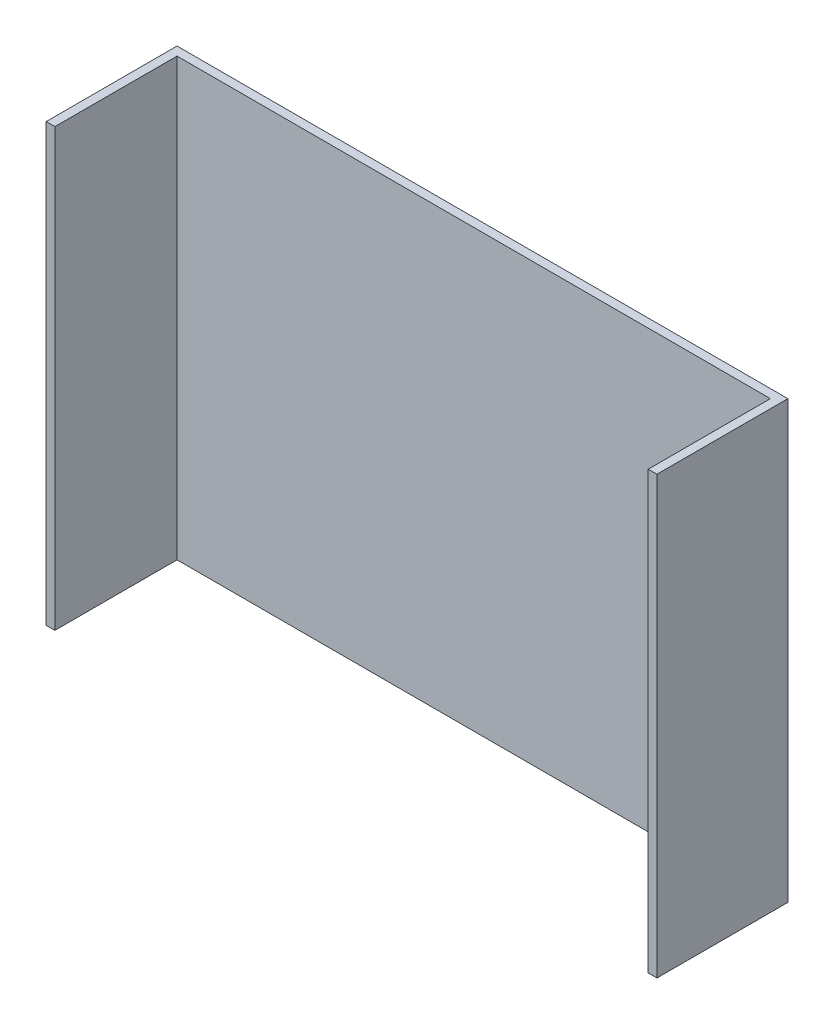
ISO-10303-21;
HEADER;
FILE_DESCRIPTION(('STEP AP214'),'2;1');
FILE_NAME('part.step','',(''),(''),'','','');
FILE_SCHEMA(('AUTOMOTIVE_DESIGN { 1 0 10303 214 1 1 1 1 }'));
ENDSEC;
DATA;
#1=APPLICATION_CONTEXT('core data for automotive mechanical design processes');
#2=APPLICATION_PROTOCOL_DEFINITION('international standard','automotive_design',2000,#1);
#3=PRODUCT_CONTEXT('',#1,'mechanical');
#4=PRODUCT('Part','Part','',(#3));
#5=PRODUCT_RELATED_PRODUCT_CATEGORY('part','',(#4));
#6=PRODUCT_DEFINITION_FORMATION('','',#4);
#7=PRODUCT_DEFINITION_CONTEXT('part definition',#1,'design');
#8=PRODUCT_DEFINITION('design','',#6,#7);
#9=PRODUCT_DEFINITION_SHAPE('','',#8);
#10=(LENGTH_UNIT() NAMED_UNIT(*) SI_UNIT(.MILLI.,.METRE.));
#11=(NAMED_UNIT(*) PLANE_ANGLE_UNIT() SI_UNIT($,.RADIAN.));
#12=(NAMED_UNIT(*) SI_UNIT($,.STERADIAN.) SOLID_ANGLE_UNIT());
#13=UNCERTAINTY_MEASURE_WITH_UNIT(LENGTH_MEASURE(1.E-05),#10,'distance_accuracy_value','');
#14=(GEOMETRIC_REPRESENTATION_CONTEXT(3) GLOBAL_UNCERTAINTY_ASSIGNED_CONTEXT((#13)) GLOBAL_UNIT_ASSIGNED_CONTEXT((#10,
#11,#12)) REPRESENTATION_CONTEXT('',''));
#15=CARTESIAN_POINT('',(0.,0.,0.));
#16=DIRECTION('',(0.,0.,1.));
#17=DIRECTION('',(1.,0.,0.));
#18=AXIS2_PLACEMENT_3D('',#15,#16,#17);
#19=CARTESIAN_POINT('',(0.,0.,30.));
#20=DIRECTION('',(0.,0.,1.));
#21=DIRECTION('',(1.,0.,0.));
#22=AXIS2_PLACEMENT_3D('',#19,#20,#21);
#23=PLANE('',#22);
#24=DIRECTION('',(0.,-1.,0.));
#25=VECTOR('',#24,1.);
#26=CARTESIAN_POINT('',(-138.,0.,30.));
#27=LINE('',#26,#25);
#28=CARTESIAN_POINT('',(-138.,100.,30.));
#29=VERTEX_POINT('',#28);
#30=CARTESIAN_POINT('',(-138.,0.,30.));
#31=VERTEX_POINT('',#30);
#32=EDGE_CURVE('E113',#29,#31,#27,.T.);
#33=ORIENTED_EDGE('',*,*,#32,.F.);
#34=DIRECTION('',(-1.,0.,0.));
#35=VECTOR('',#34,1.);
#36=CARTESIAN_POINT('',(0.,100.,30.));
#37=LINE('',#36,#35);
#38=CARTESIAN_POINT('',(-140.,100.,30.));
#39=VERTEX_POINT('',#38);
#40=EDGE_CURVE('E144',#29,#39,#37,.T.);
#41=ORIENTED_EDGE('',*,*,#40,.T.);
#42=DIRECTION('',(0.,-1.,0.));
#43=VECTOR('',#42,1.);
#44=CARTESIAN_POINT('',(-140.,0.,30.));
#45=LINE('',#44,#43);
#46=CARTESIAN_POINT('',(-140.,0.,30.));
#47=VERTEX_POINT('',#46);
#48=EDGE_CURVE('E146',#39,#47,#45,.T.);
#49=ORIENTED_EDGE('',*,*,#48,.T.);
#50=DIRECTION('',(1.,0.,0.));
#51=VECTOR('',#50,1.);
#52=CARTESIAN_POINT('',(0.,0.,30.));
#53=LINE('',#52,#51);
#54=EDGE_CURVE('E148',#47,#31,#53,.T.);
#55=ORIENTED_EDGE('',*,*,#54,.T.);
#56=EDGE_LOOP('',(#33,#41,#49,#55));
#57=FACE_BOUND('',#56,.T.);
#58=ADVANCED_FACE('F33',(#57),#23,.T.);
#59=CARTESIAN_POINT('',(0.,0.,30.));
#60=DIRECTION('',(-1.,0.,0.));
#61=DIRECTION('',(0.,0.,1.));
#62=AXIS2_PLACEMENT_3D('',#59,#60,#61);
#63=PLANE('',#62);
#64=DIRECTION('',(0.,1.,0.));
#65=VECTOR('',#64,1.);
#66=CARTESIAN_POINT('',(0.,0.,0.));
#67=LINE('',#66,#65);
#68=CARTESIAN_POINT('',(0.,0.,0.));
#69=VERTEX_POINT('',#68);
#70=CARTESIAN_POINT('',(0.,100.,0.));
#71=VERTEX_POINT('',#70);
#72=EDGE_CURVE('E138',#69,#71,#67,.T.);
#73=ORIENTED_EDGE('',*,*,#72,.T.);
#74=DIRECTION('',(0.,0.,-1.));
#75=VECTOR('',#74,1.);
#76=CARTESIAN_POINT('',(0.,100.,30.));
#77=LINE('',#76,#75);
#78=CARTESIAN_POINT('',(0.,100.,30.));
#79=VERTEX_POINT('',#78);
#80=EDGE_CURVE('E11',#79,#71,#77,.T.);
#81=ORIENTED_EDGE('',*,*,#80,.F.);
#82=DIRECTION('',(0.,1.,0.));
#83=VECTOR('',#82,1.);
#84=CARTESIAN_POINT('',(0.,0.,30.));
#85=LINE('',#84,#83);
#86=CARTESIAN_POINT('',(0.,0.,30.));
#87=VERTEX_POINT('',#86);
#88=EDGE_CURVE('E142',#87,#79,#85,.T.);
#89=ORIENTED_EDGE('',*,*,#88,.F.);
#90=DIRECTION('',(0.,0.,-1.));
#91=VECTOR('',#90,1.);
#92=CARTESIAN_POINT('',(0.,0.,30.));
#93=LINE('',#92,#91);
#94=EDGE_CURVE('E150',#87,#69,#93,.T.);
#95=ORIENTED_EDGE('',*,*,#94,.T.);
#96=EDGE_LOOP('',(#73,#81,#89,#95));
#97=FACE_BOUND('',#96,.T.);
#98=ADVANCED_FACE('F35',(#97),#63,.F.);
#99=CARTESIAN_POINT('',(0.,100.,30.));
#100=DIRECTION('',(0.,-1.,0.));
#101=DIRECTION('',(1.,0.,0.));
#102=AXIS2_PLACEMENT_3D('',#99,#100,#101);
#103=PLANE('',#102);
#104=ORIENTED_EDGE('',*,*,#40,.F.);
#105=DIRECTION('',(0.,0.,1.));
#106=VECTOR('',#105,1.);
#107=CARTESIAN_POINT('',(-138.,100.,2.));
#108=LINE('',#107,#106);
#109=CARTESIAN_POINT('',(-138.,100.,2.));
#110=VERTEX_POINT('',#109);
#111=EDGE_CURVE('E136',#110,#29,#108,.T.);
#112=ORIENTED_EDGE('',*,*,#111,.F.);
#113=DIRECTION('',(-1.,0.,0.));
#114=VECTOR('',#113,1.);
#115=CARTESIAN_POINT('',(-138.,100.,2.));
#116=LINE('',#115,#114);
#117=CARTESIAN_POINT('',(-2.,100.,2.));
#118=VERTEX_POINT('',#117);
#119=EDGE_CURVE('E117',#118,#110,#116,.T.);
#120=ORIENTED_EDGE('',*,*,#119,.F.);
#121=DIRECTION('',(0.,0.,1.));
#122=VECTOR('',#121,1.);
#123=CARTESIAN_POINT('',(-2.,100.,2.));
#124=LINE('',#123,#122);
#125=CARTESIAN_POINT('',(-2.,100.,30.));
#126=VERTEX_POINT('',#125);
#127=EDGE_CURVE('E139',#118,#126,#124,.T.);
#128=ORIENTED_EDGE('',*,*,#127,.T.);
#129=EDGE_CURVE('E85',#79,#126,#37,.T.);
#130=ORIENTED_EDGE('',*,*,#129,.F.);
#131=ORIENTED_EDGE('',*,*,#80,.T.);
#132=DIRECTION('',(-1.,0.,0.));
#133=VECTOR('',#132,1.);
#134=CARTESIAN_POINT('',(0.,100.,0.));
#135=LINE('',#134,#133);
#136=CARTESIAN_POINT('',(-140.,100.,0.));
#137=VERTEX_POINT('',#136);
#138=EDGE_CURVE('E153',#71,#137,#135,.T.);
#139=ORIENTED_EDGE('',*,*,#138,.T.);
#140=DIRECTION('',(0.,0.,-1.));
#141=VECTOR('',#140,1.);
#142=CARTESIAN_POINT('',(-140.,100.,30.));
#143=LINE('',#142,#141);
#144=EDGE_CURVE('E41',#39,#137,#143,.T.);
#145=ORIENTED_EDGE('',*,*,#144,.F.);
#146=EDGE_LOOP('',(#104,#112,#120,#128,#130,#131,#139,#145));
#147=FACE_BOUND('',#146,.T.);
#148=ADVANCED_FACE('F176',(#147),#103,.F.);
#149=CARTESIAN_POINT('',(-140.,0.,30.));
#150=DIRECTION('',(1.,0.,0.));
#151=DIRECTION('',(0.,0.,-1.));
#152=AXIS2_PLACEMENT_3D('',#149,#150,#151);
#153=PLANE('',#152);
#154=DIRECTION('',(0.,-1.,0.));
#155=VECTOR('',#154,1.);
#156=CARTESIAN_POINT('',(-140.,0.,0.));
#157=LINE('',#156,#155);
#158=CARTESIAN_POINT('',(-140.,0.,0.));
#159=VERTEX_POINT('',#158);
#160=EDGE_CURVE('E155',#137,#159,#157,.T.);
#161=ORIENTED_EDGE('',*,*,#160,.T.);
#162=DIRECTION('',(0.,0.,-1.));
#163=VECTOR('',#162,1.);
#164=CARTESIAN_POINT('',(-140.,0.,30.));
#165=LINE('',#164,#163);
#166=EDGE_CURVE('E159',#47,#159,#165,.T.);
#167=ORIENTED_EDGE('',*,*,#166,.F.);
#168=ORIENTED_EDGE('',*,*,#48,.F.);
#169=ORIENTED_EDGE('',*,*,#144,.T.);
#170=EDGE_LOOP('',(#161,#167,#168,#169));
#171=FACE_BOUND('',#170,.T.);
#172=ADVANCED_FACE('F165',(#171),#153,.F.);
#173=CARTESIAN_POINT('',(0.,0.,30.));
#174=DIRECTION('',(0.,1.,0.));
#175=DIRECTION('',(0.,0.,1.));
#176=AXIS2_PLACEMENT_3D('',#173,#174,#175);
#177=PLANE('',#176);
#178=DIRECTION('',(1.,0.,0.));
#179=VECTOR('',#178,1.);
#180=CARTESIAN_POINT('',(-138.,0.,2.));
#181=LINE('',#180,#179);
#182=CARTESIAN_POINT('',(-138.,0.,2.));
#183=VERTEX_POINT('',#182);
#184=CARTESIAN_POINT('',(-2.,0.,2.));
#185=VERTEX_POINT('',#184);
#186=EDGE_CURVE('E123',#183,#185,#181,.T.);
#187=ORIENTED_EDGE('',*,*,#186,.F.);
#188=DIRECTION('',(0.,0.,1.));
#189=VECTOR('',#188,1.);
#190=CARTESIAN_POINT('',(-138.,0.,2.));
#191=LINE('',#190,#189);
#192=EDGE_CURVE('E107',#183,#31,#191,.T.);
#193=ORIENTED_EDGE('',*,*,#192,.T.);
#194=ORIENTED_EDGE('',*,*,#54,.F.);
#195=ORIENTED_EDGE('',*,*,#166,.T.);
#196=DIRECTION('',(1.,0.,0.));
#197=VECTOR('',#196,1.);
#198=CARTESIAN_POINT('',(0.,0.,0.));
#199=LINE('',#198,#197);
#200=EDGE_CURVE('E78',#159,#69,#199,.T.);
#201=ORIENTED_EDGE('',*,*,#200,.T.);
#202=ORIENTED_EDGE('',*,*,#94,.F.);
#203=CARTESIAN_POINT('',(-2.,0.,30.));
#204=VERTEX_POINT('',#203);
#205=EDGE_CURVE('E56',#204,#87,#53,.T.);
#206=ORIENTED_EDGE('',*,*,#205,.F.);
#207=DIRECTION('',(0.,0.,1.));
#208=VECTOR('',#207,1.);
#209=CARTESIAN_POINT('',(-2.,0.,2.));
#210=LINE('',#209,#208);
#211=EDGE_CURVE('E48',#185,#204,#210,.T.);
#212=ORIENTED_EDGE('',*,*,#211,.F.);
#213=EDGE_LOOP('',(#187,#193,#194,#195,#201,#202,#206,#212));
#214=FACE_BOUND('',#213,.T.);
#215=ADVANCED_FACE('F128',(#214),#177,.F.);
#216=DIRECTION('',(0.,1.,0.));
#217=VECTOR('',#216,1.);
#218=CARTESIAN_POINT('',(-2.,0.,30.));
#219=LINE('',#218,#217);
#220=EDGE_CURVE('E126',#204,#126,#219,.T.);
#221=ORIENTED_EDGE('',*,*,#220,.F.);
#222=ORIENTED_EDGE('',*,*,#205,.T.);
#223=ORIENTED_EDGE('',*,*,#88,.T.);
#224=ORIENTED_EDGE('',*,*,#129,.T.);
#225=EDGE_LOOP('',(#221,#222,#223,#224));
#226=FACE_BOUND('',#225,.T.);
#227=ADVANCED_FACE('F174',(#226),#23,.T.);
#228=CARTESIAN_POINT('',(0.,0.,0.));
#229=DIRECTION('',(0.,0.,1.));
#230=DIRECTION('',(1.,0.,0.));
#231=AXIS2_PLACEMENT_3D('',#228,#229,#230);
#232=PLANE('',#231);
#233=ORIENTED_EDGE('',*,*,#72,.F.);
#234=ORIENTED_EDGE('',*,*,#200,.F.);
#235=ORIENTED_EDGE('',*,*,#160,.F.);
#236=ORIENTED_EDGE('',*,*,#138,.F.);
#237=EDGE_LOOP('',(#233,#234,#235,#236));
#238=FACE_BOUND('',#237,.T.);
#239=ADVANCED_FACE('F170',(#238),#232,.F.);
#240=CARTESIAN_POINT('',(-138.,0.,2.));
#241=DIRECTION('',(-1.,0.,0.));
#242=DIRECTION('',(0.,0.,1.));
#243=AXIS2_PLACEMENT_3D('',#240,#241,#242);
#244=PLANE('',#243);
#245=ORIENTED_EDGE('',*,*,#32,.T.);
#246=ORIENTED_EDGE('',*,*,#192,.F.);
#247=DIRECTION('',(0.,-1.,0.));
#248=VECTOR('',#247,1.);
#249=CARTESIAN_POINT('',(-138.,0.,2.));
#250=LINE('',#249,#248);
#251=EDGE_CURVE('E110',#110,#183,#250,.T.);
#252=ORIENTED_EDGE('',*,*,#251,.F.);
#253=ORIENTED_EDGE('',*,*,#111,.T.);
#254=EDGE_LOOP('',(#245,#246,#252,#253));
#255=FACE_BOUND('',#254,.T.);
#256=ADVANCED_FACE('F109',(#255),#244,.F.);
#257=CARTESIAN_POINT('',(-2.,0.,2.));
#258=DIRECTION('',(1.,0.,0.));
#259=DIRECTION('',(0.,0.,-1.));
#260=AXIS2_PLACEMENT_3D('',#257,#258,#259);
#261=PLANE('',#260);
#262=ORIENTED_EDGE('',*,*,#220,.T.);
#263=ORIENTED_EDGE('',*,*,#127,.F.);
#264=DIRECTION('',(0.,1.,0.));
#265=VECTOR('',#264,1.);
#266=CARTESIAN_POINT('',(-2.,0.,2.));
#267=LINE('',#266,#265);
#268=EDGE_CURVE('E129',#185,#118,#267,.T.);
#269=ORIENTED_EDGE('',*,*,#268,.F.);
#270=ORIENTED_EDGE('',*,*,#211,.T.);
#271=EDGE_LOOP('',(#262,#263,#269,#270));
#272=FACE_BOUND('',#271,.T.);
#273=ADVANCED_FACE('F175',(#272),#261,.F.);
#274=CARTESIAN_POINT('',(0.,0.,2.));
#275=DIRECTION('',(0.,0.,-1.));
#276=DIRECTION('',(-1.,0.,0.));
#277=AXIS2_PLACEMENT_3D('',#274,#275,#276);
#278=PLANE('',#277);
#279=ORIENTED_EDGE('',*,*,#251,.T.);
#280=ORIENTED_EDGE('',*,*,#186,.T.);
#281=ORIENTED_EDGE('',*,*,#268,.T.);
#282=ORIENTED_EDGE('',*,*,#119,.T.);
#283=EDGE_LOOP('',(#279,#280,#281,#282));
#284=FACE_BOUND('',#283,.T.);
#285=ADVANCED_FACE('F121',(#284),#278,.F.);
#286=CLOSED_SHELL('',(#58,#98,#148,#172,#215,#227,#239,#256,#273,#285));
#287=MANIFOLD_SOLID_BREP('B2',#286);
#288=ADVANCED_BREP_SHAPE_REPRESENTATION('',(#18,#287),#14);
#289=SHAPE_DEFINITION_REPRESENTATION(#9,#288);
ENDSEC;
END-ISO-10303-21;
